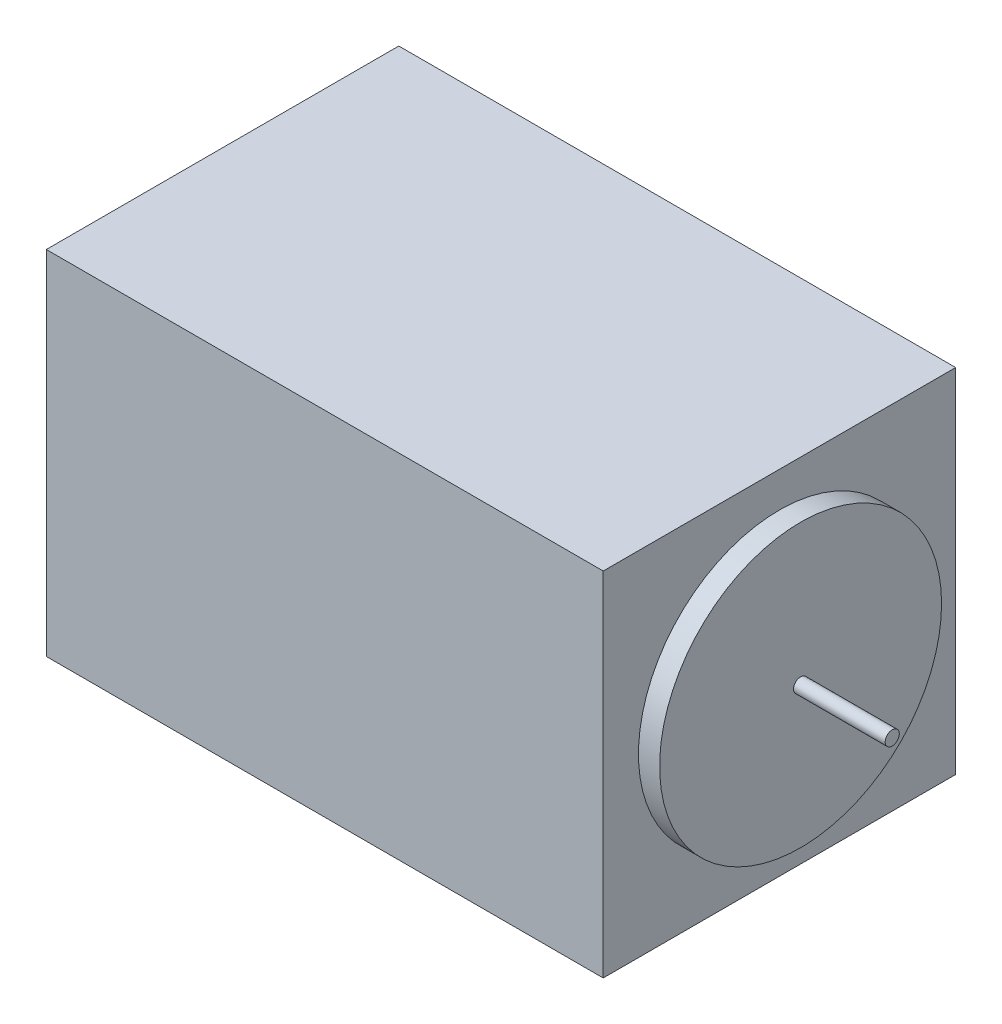
ISO-10303-21;
HEADER;
FILE_DESCRIPTION(('STEP AP214'),'2;1');
FILE_NAME('part.step','',(''),(''),'','','');
FILE_SCHEMA(('AUTOMOTIVE_DESIGN { 1 0 10303 214 1 1 1 1 }'));
ENDSEC;
DATA;
#1=APPLICATION_CONTEXT('core data for automotive mechanical design processes');
#2=APPLICATION_PROTOCOL_DEFINITION('international standard','automotive_design',2000,#1);
#3=PRODUCT_CONTEXT('',#1,'mechanical');
#4=PRODUCT('Part','Part','',(#3));
#5=PRODUCT_RELATED_PRODUCT_CATEGORY('part','',(#4));
#6=PRODUCT_DEFINITION_FORMATION('','',#4);
#7=PRODUCT_DEFINITION_CONTEXT('part definition',#1,'design');
#8=PRODUCT_DEFINITION('design','',#6,#7);
#9=PRODUCT_DEFINITION_SHAPE('','',#8);
#10=(LENGTH_UNIT() NAMED_UNIT(*) SI_UNIT(.MILLI.,.METRE.));
#11=(NAMED_UNIT(*) PLANE_ANGLE_UNIT() SI_UNIT($,.RADIAN.));
#12=(NAMED_UNIT(*) SI_UNIT($,.STERADIAN.) SOLID_ANGLE_UNIT());
#13=UNCERTAINTY_MEASURE_WITH_UNIT(LENGTH_MEASURE(1.E-05),#10,'distance_accuracy_value','');
#14=(GEOMETRIC_REPRESENTATION_CONTEXT(3) GLOBAL_UNCERTAINTY_ASSIGNED_CONTEXT((#13)) GLOBAL_UNIT_ASSIGNED_CONTEXT((#10,
#11,#12)) REPRESENTATION_CONTEXT('',''));
#15=CARTESIAN_POINT('',(0.,0.,0.));
#16=DIRECTION('',(0.,0.,1.));
#17=DIRECTION('',(1.,0.,0.));
#18=AXIS2_PLACEMENT_3D('',#15,#16,#17);
#19=CARTESIAN_POINT('',(79.,25.,-25.));
#20=DIRECTION('',(0.,0.,1.));
#21=DIRECTION('',(0.,-1.,0.));
#22=AXIS2_PLACEMENT_3D('',#19,#20,#21);
#23=PLANE('',#22);
#24=DIRECTION('',(0.,1.,0.));
#25=VECTOR('',#24,1.);
#26=CARTESIAN_POINT('',(0.,25.,-25.));
#27=LINE('',#26,#25);
#28=CARTESIAN_POINT('',(0.,-25.,-25.));
#29=VERTEX_POINT('',#28);
#30=CARTESIAN_POINT('',(0.,25.,-25.));
#31=VERTEX_POINT('',#30);
#32=EDGE_CURVE('E109',#29,#31,#27,.T.);
#33=ORIENTED_EDGE('',*,*,#32,.T.);
#34=DIRECTION('',(-1.,0.,0.));
#35=VECTOR('',#34,1.);
#36=CARTESIAN_POINT('',(79.,25.,-25.));
#37=LINE('',#36,#35);
#38=CARTESIAN_POINT('',(79.,25.,-25.));
#39=VERTEX_POINT('',#38);
#40=EDGE_CURVE('E11',#39,#31,#37,.T.);
#41=ORIENTED_EDGE('',*,*,#40,.F.);
#42=DIRECTION('',(0.,1.,0.));
#43=VECTOR('',#42,1.);
#44=CARTESIAN_POINT('',(79.,25.,-25.));
#45=LINE('',#44,#43);
#46=CARTESIAN_POINT('',(79.,-25.,-25.));
#47=VERTEX_POINT('',#46);
#48=EDGE_CURVE('E92',#47,#39,#45,.T.);
#49=ORIENTED_EDGE('',*,*,#48,.F.);
#50=DIRECTION('',(-1.,0.,0.));
#51=VECTOR('',#50,1.);
#52=CARTESIAN_POINT('',(79.,-25.,-25.));
#53=LINE('',#52,#51);
#54=EDGE_CURVE('E105',#47,#29,#53,.T.);
#55=ORIENTED_EDGE('',*,*,#54,.T.);
#56=EDGE_LOOP('',(#33,#41,#49,#55));
#57=FACE_BOUND('',#56,.T.);
#58=ADVANCED_FACE('F39',(#57),#23,.F.);
#59=CARTESIAN_POINT('',(79.,25.,25.));
#60=DIRECTION('',(0.,-1.,0.));
#61=DIRECTION('',(0.,0.,-1.));
#62=AXIS2_PLACEMENT_3D('',#59,#60,#61);
#63=PLANE('',#62);
#64=DIRECTION('',(0.,0.,1.));
#65=VECTOR('',#64,1.);
#66=CARTESIAN_POINT('',(0.,25.,25.));
#67=LINE('',#66,#65);
#68=CARTESIAN_POINT('',(0.,25.,25.));
#69=VERTEX_POINT('',#68);
#70=EDGE_CURVE('E97',#31,#69,#67,.T.);
#71=ORIENTED_EDGE('',*,*,#70,.T.);
#72=DIRECTION('',(-1.,0.,0.));
#73=VECTOR('',#72,1.);
#74=CARTESIAN_POINT('',(79.,25.,25.));
#75=LINE('',#74,#73);
#76=CARTESIAN_POINT('',(79.,25.,25.));
#77=VERTEX_POINT('',#76);
#78=EDGE_CURVE('E49',#77,#69,#75,.T.);
#79=ORIENTED_EDGE('',*,*,#78,.F.);
#80=DIRECTION('',(0.,0.,1.));
#81=VECTOR('',#80,1.);
#82=CARTESIAN_POINT('',(79.,25.,25.));
#83=LINE('',#82,#81);
#84=EDGE_CURVE('E87',#39,#77,#83,.T.);
#85=ORIENTED_EDGE('',*,*,#84,.F.);
#86=ORIENTED_EDGE('',*,*,#40,.T.);
#87=EDGE_LOOP('',(#71,#79,#85,#86));
#88=FACE_BOUND('',#87,.T.);
#89=ADVANCED_FACE('F96',(#88),#63,.F.);
#90=CARTESIAN_POINT('',(79.,25.,25.));
#91=DIRECTION('',(0.,0.,-1.));
#92=DIRECTION('',(0.,1.,0.));
#93=AXIS2_PLACEMENT_3D('',#90,#91,#92);
#94=PLANE('',#93);
#95=DIRECTION('',(0.,-1.,0.));
#96=VECTOR('',#95,1.);
#97=CARTESIAN_POINT('',(0.,25.,25.));
#98=LINE('',#97,#96);
#99=CARTESIAN_POINT('',(0.,-25.,25.));
#100=VERTEX_POINT('',#99);
#101=EDGE_CURVE('E74',#69,#100,#98,.T.);
#102=ORIENTED_EDGE('',*,*,#101,.T.);
#103=DIRECTION('',(-1.,0.,0.));
#104=VECTOR('',#103,1.);
#105=CARTESIAN_POINT('',(79.,-25.,25.));
#106=LINE('',#105,#104);
#107=CARTESIAN_POINT('',(79.,-25.,25.));
#108=VERTEX_POINT('',#107);
#109=EDGE_CURVE('E99',#108,#100,#106,.T.);
#110=ORIENTED_EDGE('',*,*,#109,.F.);
#111=DIRECTION('',(0.,-1.,0.));
#112=VECTOR('',#111,1.);
#113=CARTESIAN_POINT('',(79.,25.,25.));
#114=LINE('',#113,#112);
#115=EDGE_CURVE('E90',#77,#108,#114,.T.);
#116=ORIENTED_EDGE('',*,*,#115,.F.);
#117=ORIENTED_EDGE('',*,*,#78,.T.);
#118=EDGE_LOOP('',(#102,#110,#116,#117));
#119=FACE_BOUND('',#118,.T.);
#120=ADVANCED_FACE('F101',(#119),#94,.F.);
#121=CARTESIAN_POINT('',(79.,-25.,25.));
#122=DIRECTION('',(0.,1.,0.));
#123=DIRECTION('',(0.,0.,1.));
#124=AXIS2_PLACEMENT_3D('',#121,#122,#123);
#125=PLANE('',#124);
#126=DIRECTION('',(0.,0.,-1.));
#127=VECTOR('',#126,1.);
#128=CARTESIAN_POINT('',(0.,-25.,25.));
#129=LINE('',#128,#127);
#130=EDGE_CURVE('E80',#100,#29,#129,.T.);
#131=ORIENTED_EDGE('',*,*,#130,.T.);
#132=ORIENTED_EDGE('',*,*,#54,.F.);
#133=DIRECTION('',(0.,0.,-1.));
#134=VECTOR('',#133,1.);
#135=CARTESIAN_POINT('',(79.,-25.,25.));
#136=LINE('',#135,#134);
#137=EDGE_CURVE('E57',#108,#47,#136,.T.);
#138=ORIENTED_EDGE('',*,*,#137,.F.);
#139=ORIENTED_EDGE('',*,*,#109,.T.);
#140=EDGE_LOOP('',(#131,#132,#138,#139));
#141=FACE_BOUND('',#140,.T.);
#142=ADVANCED_FACE('F123',(#141),#125,.F.);
#143=CARTESIAN_POINT('',(79.,0.,0.));
#144=DIRECTION('',(1.,0.,0.));
#145=DIRECTION('',(0.,0.,-1.));
#146=AXIS2_PLACEMENT_3D('',#143,#144,#145);
#147=PLANE('',#146);
#148=CARTESIAN_POINT('',(79.,0.,0.));
#149=DIRECTION('',(1.,0.,0.));
#150=DIRECTION('',(0.,0.,-1.));
#151=AXIS2_PLACEMENT_3D('',#148,#149,#150);
#152=CIRCLE('',#151,20.);
#153=CARTESIAN_POINT('',(79.,0.,-20.));
#154=VERTEX_POINT('',#153);
#155=EDGE_CURVE('E113',#154,#154,#152,.F.);
#156=ORIENTED_EDGE('',*,*,#155,.T.);
#157=EDGE_LOOP('',(#156));
#158=FACE_BOUND('',#157,.T.);
#159=ORIENTED_EDGE('',*,*,#48,.T.);
#160=ORIENTED_EDGE('',*,*,#84,.T.);
#161=ORIENTED_EDGE('',*,*,#115,.T.);
#162=ORIENTED_EDGE('',*,*,#137,.T.);
#163=EDGE_LOOP('',(#159,#160,#161,#162));
#164=FACE_BOUND('',#163,.T.);
#165=ADVANCED_FACE('F88',(#158,#164),#147,.T.);
#166=CARTESIAN_POINT('',(0.,0.,0.));
#167=DIRECTION('',(1.,0.,0.));
#168=DIRECTION('',(0.,0.,-1.));
#169=AXIS2_PLACEMENT_3D('',#166,#167,#168);
#170=PLANE('',#169);
#171=ORIENTED_EDGE('',*,*,#32,.F.);
#172=ORIENTED_EDGE('',*,*,#130,.F.);
#173=ORIENTED_EDGE('',*,*,#101,.F.);
#174=ORIENTED_EDGE('',*,*,#70,.F.);
#175=EDGE_LOOP('',(#171,#172,#173,#174));
#176=FACE_BOUND('',#175,.T.);
#177=ADVANCED_FACE('F126',(#176),#170,.F.);
#178=CARTESIAN_POINT('',(82.,0.,0.));
#179=DIRECTION('',(-1.,0.,0.));
#180=DIRECTION('',(0.,0.,1.));
#181=AXIS2_PLACEMENT_3D('',#178,#179,#180);
#182=CYLINDRICAL_SURFACE('',#181,20.);
#183=ORIENTED_EDGE('',*,*,#155,.F.);
#184=EDGE_LOOP('',(#183));
#185=FACE_BOUND('',#184,.T.);
#186=CARTESIAN_POINT('',(82.,0.,0.));
#187=DIRECTION('',(1.,0.,0.));
#188=DIRECTION('',(0.,0.,-1.));
#189=AXIS2_PLACEMENT_3D('',#186,#187,#188);
#190=CIRCLE('',#189,20.);
#191=CARTESIAN_POINT('',(82.,0.,-20.));
#192=VERTEX_POINT('',#191);
#193=EDGE_CURVE('E133',#192,#192,#190,.T.);
#194=ORIENTED_EDGE('',*,*,#193,.F.);
#195=EDGE_LOOP('',(#194));
#196=FACE_BOUND('',#195,.T.);
#197=ADVANCED_FACE('F159',(#185,#196),#182,.T.);
#198=CARTESIAN_POINT('',(82.,0.,0.));
#199=DIRECTION('',(1.,0.,0.));
#200=DIRECTION('',(0.,0.,-1.));
#201=AXIS2_PLACEMENT_3D('',#198,#199,#200);
#202=PLANE('',#201);
#203=CARTESIAN_POINT('',(82.,0.,0.));
#204=DIRECTION('',(1.,0.,0.));
#205=DIRECTION('',(0.,0.,-1.));
#206=AXIS2_PLACEMENT_3D('',#203,#204,#205);
#207=CIRCLE('',#206,1.);
#208=CARTESIAN_POINT('',(82.,0.,-1.));
#209=VERTEX_POINT('',#208);
#210=EDGE_CURVE('E42',#209,#209,#207,.F.);
#211=ORIENTED_EDGE('',*,*,#210,.T.);
#212=EDGE_LOOP('',(#211));
#213=FACE_BOUND('',#212,.T.);
#214=ORIENTED_EDGE('',*,*,#193,.T.);
#215=EDGE_LOOP('',(#214));
#216=FACE_BOUND('',#215,.T.);
#217=ADVANCED_FACE('F146',(#213,#216),#202,.T.);
#218=CARTESIAN_POINT('',(95.,0.,0.));
#219=DIRECTION('',(-1.,0.,0.));
#220=DIRECTION('',(0.,0.,1.));
#221=AXIS2_PLACEMENT_3D('',#218,#219,#220);
#222=CYLINDRICAL_SURFACE('',#221,1.);
#223=ORIENTED_EDGE('',*,*,#210,.F.);
#224=EDGE_LOOP('',(#223));
#225=FACE_BOUND('',#224,.T.);
#226=CARTESIAN_POINT('',(95.,0.,0.));
#227=DIRECTION('',(1.,0.,0.));
#228=DIRECTION('',(0.,0.,-1.));
#229=AXIS2_PLACEMENT_3D('',#226,#227,#228);
#230=CIRCLE('',#229,1.);
#231=CARTESIAN_POINT('',(95.,0.,-1.));
#232=VERTEX_POINT('',#231);
#233=EDGE_CURVE('E137',#232,#232,#230,.T.);
#234=ORIENTED_EDGE('',*,*,#233,.F.);
#235=EDGE_LOOP('',(#234));
#236=FACE_BOUND('',#235,.T.);
#237=ADVANCED_FACE('F149',(#225,#236),#222,.T.);
#238=CARTESIAN_POINT('',(95.,0.,0.));
#239=DIRECTION('',(1.,0.,0.));
#240=DIRECTION('',(0.,0.,-1.));
#241=AXIS2_PLACEMENT_3D('',#238,#239,#240);
#242=PLANE('',#241);
#243=ORIENTED_EDGE('',*,*,#233,.T.);
#244=EDGE_LOOP('',(#243));
#245=FACE_BOUND('',#244,.T.);
#246=ADVANCED_FACE('F152',(#245),#242,.T.);
#247=CLOSED_SHELL('',(#58,#89,#120,#142,#165,#177,#197,#217,#237,#246));
#248=MANIFOLD_SOLID_BREP('B2',#247);
#249=ADVANCED_BREP_SHAPE_REPRESENTATION('',(#18,#248),#14);
#250=SHAPE_DEFINITION_REPRESENTATION(#9,#249);
ENDSEC;
END-ISO-10303-21;
